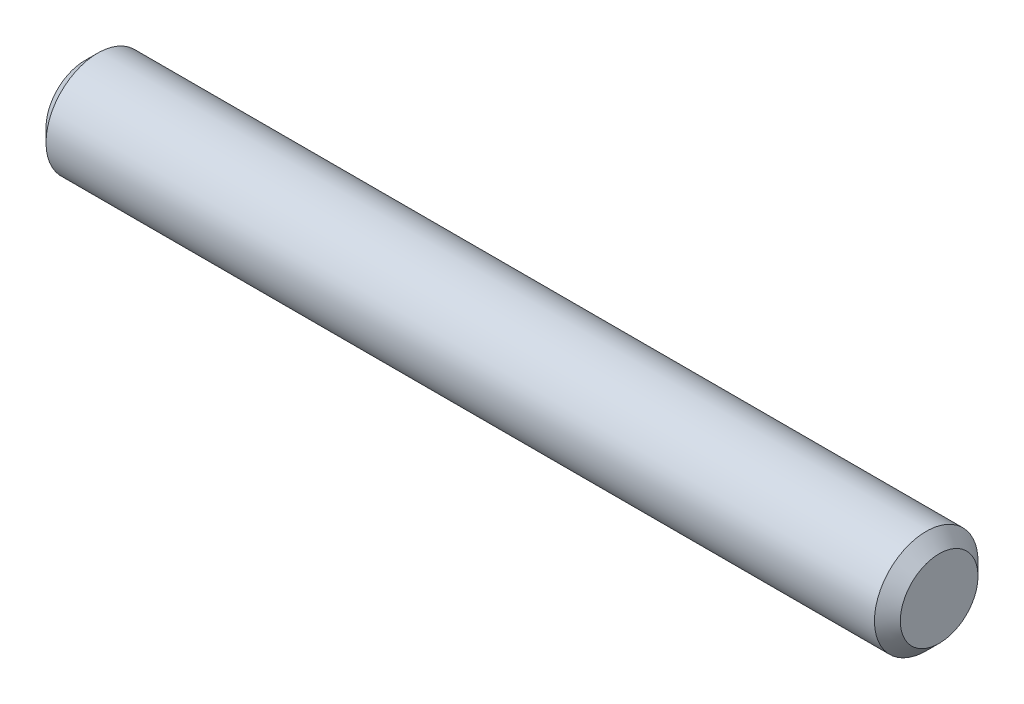
ISO-10303-21;
HEADER;
FILE_DESCRIPTION(('STEP AP214'),'2;1');
FILE_NAME('part.step','',(''),(''),'','','');
FILE_SCHEMA(('AUTOMOTIVE_DESIGN { 1 0 10303 214 1 1 1 1 }'));
ENDSEC;
DATA;
#1=APPLICATION_CONTEXT('core data for automotive mechanical design processes');
#2=APPLICATION_PROTOCOL_DEFINITION('international standard','automotive_design',2000,#1);
#3=PRODUCT_CONTEXT('',#1,'mechanical');
#4=PRODUCT('Part','Part','',(#3));
#5=PRODUCT_RELATED_PRODUCT_CATEGORY('part','',(#4));
#6=PRODUCT_DEFINITION_FORMATION('','',#4);
#7=PRODUCT_DEFINITION_CONTEXT('part definition',#1,'design');
#8=PRODUCT_DEFINITION('design','',#6,#7);
#9=PRODUCT_DEFINITION_SHAPE('','',#8);
#10=(LENGTH_UNIT() NAMED_UNIT(*) SI_UNIT(.MILLI.,.METRE.));
#11=(NAMED_UNIT(*) PLANE_ANGLE_UNIT() SI_UNIT($,.RADIAN.));
#12=(NAMED_UNIT(*) SI_UNIT($,.STERADIAN.) SOLID_ANGLE_UNIT());
#13=UNCERTAINTY_MEASURE_WITH_UNIT(LENGTH_MEASURE(1.E-05),#10,'distance_accuracy_value','');
#14=(GEOMETRIC_REPRESENTATION_CONTEXT(3) GLOBAL_UNCERTAINTY_ASSIGNED_CONTEXT((#13)) GLOBAL_UNIT_ASSIGNED_CONTEXT((#10,
#11,#12)) REPRESENTATION_CONTEXT('',''));
#15=CARTESIAN_POINT('',(0.,0.,0.));
#16=DIRECTION('',(0.,0.,1.));
#17=DIRECTION('',(1.,0.,0.));
#18=AXIS2_PLACEMENT_3D('',#15,#16,#17);
#19=CARTESIAN_POINT('',(0.,0.,0.));
#20=DIRECTION('',(-1.,0.,0.));
#21=DIRECTION('',(0.,0.,1.));
#22=AXIS2_PLACEMENT_3D('',#19,#20,#21);
#23=PLANE('',#22);
#24=CARTESIAN_POINT('',(0.,0.,0.));
#25=DIRECTION('',(-1.,0.,0.));
#26=DIRECTION('',(0.,0.,1.));
#27=AXIS2_PLACEMENT_3D('',#24,#25,#26);
#28=CIRCLE('',#27,3.);
#29=CARTESIAN_POINT('',(0.,0.,3.));
#30=VERTEX_POINT('',#29);
#31=EDGE_CURVE('E10',#30,#30,#28,.T.);
#32=ORIENTED_EDGE('',*,*,#31,.T.);
#33=EDGE_LOOP('',(#32));
#34=FACE_BOUND('',#33,.T.);
#35=ADVANCED_FACE('F31',(#34),#23,.T.);
#36=CARTESIAN_POINT('',(0.,0.,0.));
#37=DIRECTION('',(1.,0.,0.));
#38=DIRECTION('',(0.,0.,-1.));
#39=AXIS2_PLACEMENT_3D('',#36,#37,#38);
#40=CONICAL_SURFACE('',#39,3.,0.785398163397446);
#41=CARTESIAN_POINT('',(1.,0.,0.));
#42=DIRECTION('',(-1.,0.,0.));
#43=DIRECTION('',(0.,0.,1.));
#44=AXIS2_PLACEMENT_3D('',#41,#42,#43);
#45=CIRCLE('',#44,4.);
#46=CARTESIAN_POINT('',(1.,0.,4.));
#47=VERTEX_POINT('',#46);
#48=EDGE_CURVE('E37',#47,#47,#45,.T.);
#49=ORIENTED_EDGE('',*,*,#48,.T.);
#50=EDGE_LOOP('',(#49));
#51=FACE_BOUND('',#50,.T.);
#52=ORIENTED_EDGE('',*,*,#31,.F.);
#53=EDGE_LOOP('',(#52));
#54=FACE_BOUND('',#53,.T.);
#55=ADVANCED_FACE('F63',(#51,#54),#40,.T.);
#56=CARTESIAN_POINT('',(-3.,0.,0.));
#57=DIRECTION('',(-1.,0.,0.));
#58=DIRECTION('',(0.,0.,1.));
#59=AXIS2_PLACEMENT_3D('',#56,#57,#58);
#60=CYLINDRICAL_SURFACE('',#59,4.);
#61=CARTESIAN_POINT('',(65.0000000000001,0.,0.));
#62=DIRECTION('',(-1.,0.,0.));
#63=DIRECTION('',(0.,0.,1.));
#64=AXIS2_PLACEMENT_3D('',#61,#62,#63);
#65=CIRCLE('',#64,4.);
#66=CARTESIAN_POINT('',(65.0000000000001,0.,4.));
#67=VERTEX_POINT('',#66);
#68=EDGE_CURVE('E41',#67,#67,#65,.T.);
#69=ORIENTED_EDGE('',*,*,#68,.T.);
#70=EDGE_LOOP('',(#69));
#71=FACE_BOUND('',#70,.T.);
#72=ORIENTED_EDGE('',*,*,#48,.F.);
#73=EDGE_LOOP('',(#72));
#74=FACE_BOUND('',#73,.T.);
#75=ADVANCED_FACE('F60',(#71,#74),#60,.T.);
#76=CARTESIAN_POINT('',(65.0000000000001,0.,0.));
#77=DIRECTION('',(-1.,0.,0.));
#78=DIRECTION('',(0.,0.,1.));
#79=AXIS2_PLACEMENT_3D('',#76,#77,#78);
#80=CONICAL_SURFACE('',#79,4.,0.785398163397448);
#81=CARTESIAN_POINT('',(66.0000000000001,0.,0.));
#82=DIRECTION('',(-1.,0.,0.));
#83=DIRECTION('',(0.,0.,1.));
#84=AXIS2_PLACEMENT_3D('',#81,#82,#83);
#85=CIRCLE('',#84,3.);
#86=CARTESIAN_POINT('',(66.0000000000001,0.,3.));
#87=VERTEX_POINT('',#86);
#88=EDGE_CURVE('E45',#87,#87,#85,.T.);
#89=ORIENTED_EDGE('',*,*,#88,.T.);
#90=EDGE_LOOP('',(#89));
#91=FACE_BOUND('',#90,.T.);
#92=ORIENTED_EDGE('',*,*,#68,.F.);
#93=EDGE_LOOP('',(#92));
#94=FACE_BOUND('',#93,.T.);
#95=ADVANCED_FACE('F51',(#91,#94),#80,.T.);
#96=CARTESIAN_POINT('',(66.0000000000001,3.,0.));
#97=DIRECTION('',(1.,0.,0.));
#98=DIRECTION('',(0.,0.,-1.));
#99=AXIS2_PLACEMENT_3D('',#96,#97,#98);
#100=PLANE('',#99);
#101=ORIENTED_EDGE('',*,*,#88,.F.);
#102=EDGE_LOOP('',(#101));
#103=FACE_BOUND('',#102,.T.);
#104=ADVANCED_FACE('F54',(#103),#100,.T.);
#105=CLOSED_SHELL('',(#35,#55,#75,#95,#104));
#106=MANIFOLD_SOLID_BREP('B2',#105);
#107=ADVANCED_BREP_SHAPE_REPRESENTATION('',(#18,#106),#14);
#108=SHAPE_DEFINITION_REPRESENTATION(#9,#107);
ENDSEC;
END-ISO-10303-21;
